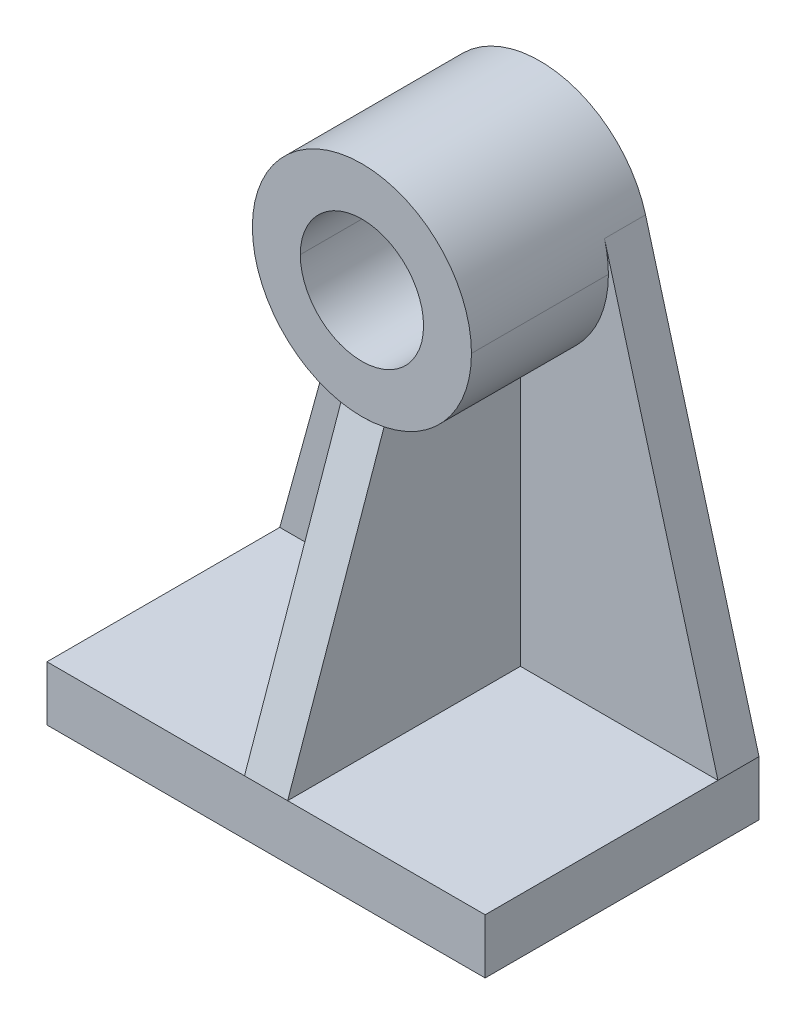
ISO-10303-21;
HEADER;
FILE_DESCRIPTION(('STEP AP214'),'2;1');
FILE_NAME('part.step','',(''),(''),'','','');
FILE_SCHEMA(('AUTOMOTIVE_DESIGN { 1 0 10303 214 1 1 1 1 }'));
ENDSEC;
DATA;
#1=APPLICATION_CONTEXT('core data for automotive mechanical design processes');
#2=APPLICATION_PROTOCOL_DEFINITION('international standard','automotive_design',2000,#1);
#3=PRODUCT_CONTEXT('',#1,'mechanical');
#4=PRODUCT('Part','Part','',(#3));
#5=PRODUCT_RELATED_PRODUCT_CATEGORY('part','',(#4));
#6=PRODUCT_DEFINITION_FORMATION('','',#4);
#7=PRODUCT_DEFINITION_CONTEXT('part definition',#1,'design');
#8=PRODUCT_DEFINITION('design','',#6,#7);
#9=PRODUCT_DEFINITION_SHAPE('','',#8);
#10=(LENGTH_UNIT() NAMED_UNIT(*) SI_UNIT(.MILLI.,.METRE.));
#11=(NAMED_UNIT(*) PLANE_ANGLE_UNIT() SI_UNIT($,.RADIAN.));
#12=(NAMED_UNIT(*) SI_UNIT($,.STERADIAN.) SOLID_ANGLE_UNIT());
#13=UNCERTAINTY_MEASURE_WITH_UNIT(LENGTH_MEASURE(1.E-05),#10,'distance_accuracy_value','');
#14=(GEOMETRIC_REPRESENTATION_CONTEXT(3) GLOBAL_UNCERTAINTY_ASSIGNED_CONTEXT((#13)) GLOBAL_UNIT_ASSIGNED_CONTEXT((#10,
#11,#12)) REPRESENTATION_CONTEXT('',''));
#15=CARTESIAN_POINT('',(0.,0.,0.));
#16=DIRECTION('',(0.,0.,1.));
#17=DIRECTION('',(1.,0.,0.));
#18=AXIS2_PLACEMENT_3D('',#15,#16,#17);
#19=CARTESIAN_POINT('',(-50.8,-88.9,63.5));
#20=DIRECTION('',(0.,-1.,0.));
#21=DIRECTION('',(0.,0.,-1.));
#22=AXIS2_PLACEMENT_3D('',#19,#20,#21);
#23=PLANE('',#22);
#24=DIRECTION('',(0.,0.,1.));
#25=VECTOR('',#24,1.);
#26=CARTESIAN_POINT('',(-5.,-88.9,63.5));
#27=LINE('',#26,#25);
#28=CARTESIAN_POINT('',(-5.,-88.9,9.52500000000001));
#29=VERTEX_POINT('',#28);
#30=CARTESIAN_POINT('',(-5.,-88.9,63.5));
#31=VERTEX_POINT('',#30);
#32=EDGE_CURVE('E310',#29,#31,#27,.T.);
#33=ORIENTED_EDGE('',*,*,#32,.F.);
#34=DIRECTION('',(-1.,0.,0.));
#35=VECTOR('',#34,1.);
#36=CARTESIAN_POINT('',(-50.8,-88.9,9.525));
#37=LINE('',#36,#35);
#38=CARTESIAN_POINT('',(-50.8,-88.9,9.525));
#39=VERTEX_POINT('',#38);
#40=EDGE_CURVE('E153',#29,#39,#37,.T.);
#41=ORIENTED_EDGE('',*,*,#40,.T.);
#42=DIRECTION('',(0.,0.,-1.));
#43=VECTOR('',#42,1.);
#44=CARTESIAN_POINT('',(-50.8,-88.9,63.5));
#45=LINE('',#44,#43);
#46=CARTESIAN_POINT('',(-50.8,-88.9,63.5));
#47=VERTEX_POINT('',#46);
#48=EDGE_CURVE('E224',#47,#39,#45,.T.);
#49=ORIENTED_EDGE('',*,*,#48,.F.);
#50=DIRECTION('',(-1.,0.,0.));
#51=VECTOR('',#50,1.);
#52=CARTESIAN_POINT('',(-50.8,-88.9,63.5));
#53=LINE('',#52,#51);
#54=EDGE_CURVE('E250',#31,#47,#53,.T.);
#55=ORIENTED_EDGE('',*,*,#54,.F.);
#56=EDGE_LOOP('',(#33,#41,#49,#55));
#57=FACE_BOUND('',#56,.T.);
#58=ADVANCED_FACE('F43',(#57),#23,.F.);
#59=CARTESIAN_POINT('',(0.,0.,9.525));
#60=DIRECTION('',(0.,0.,-1.));
#61=DIRECTION('',(-1.,0.,0.));
#62=AXIS2_PLACEMENT_3D('',#59,#60,#61);
#63=CYLINDRICAL_SURFACE('',#62,25.4);
#64=DIRECTION('',(0.,0.,-1.));
#65=VECTOR('',#64,1.);
#66=CARTESIAN_POINT('',(5.,-24.9030118660374,9.525));
#67=LINE('',#66,#65);
#68=CARTESIAN_POINT('',(5.,-24.9030118660374,9.525));
#69=VERTEX_POINT('',#68);
#70=CARTESIAN_POINT('',(5.,-24.9030118660374,41.1010541531131));
#71=VERTEX_POINT('',#70);
#72=EDGE_CURVE('E326',#69,#71,#67,.F.);
#73=ORIENTED_EDGE('',*,*,#72,.F.);
#74=CARTESIAN_POINT('',(0.,0.,9.525));
#75=DIRECTION('',(0.,0.,-1.));
#76=DIRECTION('',(1.,0.,0.));
#77=AXIS2_PLACEMENT_3D('',#74,#75,#76);
#78=CIRCLE('',#77,25.4);
#79=CARTESIAN_POINT('',(25.4,0.,9.525));
#80=VERTEX_POINT('',#79);
#81=EDGE_CURVE('E100',#80,#69,#78,.T.);
#82=ORIENTED_EDGE('',*,*,#81,.F.);
#83=DIRECTION('',(0.,0.,-1.));
#84=VECTOR('',#83,1.);
#85=CARTESIAN_POINT('',(25.4,0.,9.525));
#86=LINE('',#85,#84);
#87=CARTESIAN_POINT('',(25.4,0.,41.275));
#88=VERTEX_POINT('',#87);
#89=EDGE_CURVE('E272',#88,#80,#86,.T.);
#90=ORIENTED_EDGE('',*,*,#89,.F.);
#91=CARTESIAN_POINT('',(0.,0.,41.275));
#92=DIRECTION('',(0.,0.,1.));
#93=DIRECTION('',(1.,0.,0.));
#94=AXIS2_PLACEMENT_3D('',#91,#92,#93);
#95=CIRCLE('',#94,25.4);
#96=CARTESIAN_POINT('',(0.,-25.4,41.275));
#97=VERTEX_POINT('',#96);
#98=EDGE_CURVE('E243',#97,#88,#95,.T.);
#99=ORIENTED_EDGE('',*,*,#98,.F.);
#100=CARTESIAN_POINT('',(0.,0.,32.385));
#101=DIRECTION('',(0.,0.330350424728106,0.943858356366018));
#102=DIRECTION('',(0.,0.943858356366018,-0.330350424728106));
#103=AXIS2_PLACEMENT_3D('',#100,#101,#102);
#104=ELLIPSE('',#103,26.9108175275297,25.4);
#105=EDGE_CURVE('E334',#71,#97,#104,.F.);
#106=ORIENTED_EDGE('',*,*,#105,.F.);
#107=EDGE_LOOP('',(#73,#82,#90,#99,#106));
#108=FACE_BOUND('',#107,.T.);
#109=ADVANCED_FACE('F546',(#108),#63,.T.);
#110=CARTESIAN_POINT('',(0.,0.,9.525));
#111=DIRECTION('',(0.,0.,1.));
#112=DIRECTION('',(1.,0.,0.));
#113=AXIS2_PLACEMENT_3D('',#110,#111,#112);
#114=PLANE('',#113);
#115=ORIENTED_EDGE('',*,*,#40,.F.);
#116=DIRECTION('',(0.,1.,0.));
#117=VECTOR('',#116,1.);
#118=CARTESIAN_POINT('',(-5.,0.,9.525));
#119=LINE('',#118,#117);
#120=CARTESIAN_POINT('',(-5.,-24.9030118660374,9.525));
#121=VERTEX_POINT('',#120);
#122=EDGE_CURVE('E306',#29,#121,#119,.T.);
#123=ORIENTED_EDGE('',*,*,#122,.T.);
#124=CARTESIAN_POINT('',(-25.4,0.,9.525));
#125=VERTEX_POINT('',#124);
#126=EDGE_CURVE('E285',#121,#125,#78,.T.);
#127=ORIENTED_EDGE('',*,*,#126,.T.);
#128=CARTESIAN_POINT('',(0.,0.,9.525));
#129=DIRECTION('',(0.,0.,-1.));
#130=DIRECTION('',(1.,0.,0.));
#131=AXIS2_PLACEMENT_3D('',#128,#129,#130);
#132=CIRCLE('',#131,25.4);
#133=CARTESIAN_POINT('',(-24.4901906519416,6.73725180110948,9.525));
#134=VERTEX_POINT('',#133);
#135=EDGE_CURVE('E236',#125,#134,#132,.T.);
#136=ORIENTED_EDGE('',*,*,#135,.T.);
#137=DIRECTION('',(-0.265246133901948,-0.964180734328409,0.));
#138=VECTOR('',#137,1.);
#139=CARTESIAN_POINT('',(-50.8,-88.9,9.525));
#140=LINE('',#139,#138);
#141=EDGE_CURVE('E305',#134,#39,#140,.T.);
#142=ORIENTED_EDGE('',*,*,#141,.T.);
#143=EDGE_LOOP('',(#115,#123,#127,#136,#142));
#144=FACE_BOUND('',#143,.T.);
#145=ADVANCED_FACE('F304',(#144),#114,.T.);
#146=CARTESIAN_POINT('',(0.,0.,0.));
#147=DIRECTION('',(0.,0.,1.));
#148=DIRECTION('',(1.,0.,0.));
#149=AXIS2_PLACEMENT_3D('',#146,#147,#148);
#150=CYLINDRICAL_SURFACE('',#149,14.2875);
#151=DIRECTION('',(0.,0.,1.));
#152=VECTOR('',#151,1.);
#153=CARTESIAN_POINT('',(-14.2875,0.,0.));
#154=LINE('',#153,#152);
#155=CARTESIAN_POINT('',(-14.2875,0.,0.));
#156=VERTEX_POINT('',#155);
#157=CARTESIAN_POINT('',(-14.2875,0.,41.275));
#158=VERTEX_POINT('',#157);
#159=EDGE_CURVE('E230',#156,#158,#154,.T.);
#160=ORIENTED_EDGE('',*,*,#159,.F.);
#161=CARTESIAN_POINT('',(0.,0.,0.));
#162=DIRECTION('',(0.,0.,1.));
#163=DIRECTION('',(1.,0.,0.));
#164=AXIS2_PLACEMENT_3D('',#161,#162,#163);
#165=CIRCLE('',#164,14.2875);
#166=CARTESIAN_POINT('',(14.2875,0.,0.));
#167=VERTEX_POINT('',#166);
#168=EDGE_CURVE('E247',#167,#156,#165,.T.);
#169=ORIENTED_EDGE('',*,*,#168,.F.);
#170=DIRECTION('',(0.,0.,1.));
#171=VECTOR('',#170,1.);
#172=CARTESIAN_POINT('',(14.2875,0.,0.));
#173=LINE('',#172,#171);
#174=CARTESIAN_POINT('',(14.2875,0.,41.275));
#175=VERTEX_POINT('',#174);
#176=EDGE_CURVE('E251',#167,#175,#173,.T.);
#177=ORIENTED_EDGE('',*,*,#176,.T.);
#178=CARTESIAN_POINT('',(0.,0.,41.275));
#179=DIRECTION('',(0.,0.,1.));
#180=DIRECTION('',(1.,0.,0.));
#181=AXIS2_PLACEMENT_3D('',#178,#179,#180);
#182=CIRCLE('',#181,14.2875);
#183=EDGE_CURVE('E11',#175,#158,#182,.T.);
#184=ORIENTED_EDGE('',*,*,#183,.T.);
#185=EDGE_LOOP('',(#160,#169,#177,#184));
#186=FACE_BOUND('',#185,.T.);
#187=ADVANCED_FACE('F376',(#186),#150,.F.);
#188=CARTESIAN_POINT('',(0.,0.,41.275));
#189=DIRECTION('',(0.,0.,1.));
#190=DIRECTION('',(1.,0.,0.));
#191=AXIS2_PLACEMENT_3D('',#188,#189,#190);
#192=PLANE('',#191);
#193=ORIENTED_EDGE('',*,*,#183,.F.);
#194=CARTESIAN_POINT('',(0.,0.,41.275));
#195=DIRECTION('',(0.,0.,1.));
#196=DIRECTION('',(1.,0.,0.));
#197=AXIS2_PLACEMENT_3D('',#194,#195,#196);
#198=CIRCLE('',#197,14.2875);
#199=EDGE_CURVE('E234',#158,#175,#198,.T.);
#200=ORIENTED_EDGE('',*,*,#199,.F.);
#201=EDGE_LOOP('',(#193,#200));
#202=FACE_BOUND('',#201,.T.);
#203=CARTESIAN_POINT('',(-25.4,0.,41.275));
#204=VERTEX_POINT('',#203);
#205=EDGE_CURVE('E117',#204,#97,#95,.T.);
#206=ORIENTED_EDGE('',*,*,#205,.T.);
#207=ORIENTED_EDGE('',*,*,#98,.T.);
#208=CARTESIAN_POINT('',(0.,0.,41.275));
#209=DIRECTION('',(0.,0.,1.));
#210=DIRECTION('',(1.,0.,0.));
#211=AXIS2_PLACEMENT_3D('',#208,#209,#210);
#212=CIRCLE('',#211,25.4);
#213=EDGE_CURVE('E254',#88,#204,#212,.T.);
#214=ORIENTED_EDGE('',*,*,#213,.T.);
#215=EDGE_LOOP('',(#206,#207,#214));
#216=FACE_BOUND('',#215,.T.);
#217=ADVANCED_FACE('F372',(#202,#216),#192,.T.);
#218=CARTESIAN_POINT('',(50.8,-101.6,63.5));
#219=DIRECTION('',(0.,0.,1.));
#220=DIRECTION('',(1.,0.,0.));
#221=AXIS2_PLACEMENT_3D('',#218,#219,#220);
#222=PLANE('',#221);
#223=CARTESIAN_POINT('',(50.8,-88.9,63.5));
#224=VERTEX_POINT('',#223);
#225=CARTESIAN_POINT('',(5.,-88.9,63.5));
#226=VERTEX_POINT('',#225);
#227=EDGE_CURVE('E53',#224,#226,#53,.T.);
#228=ORIENTED_EDGE('',*,*,#227,.T.);
#229=DIRECTION('',(-1.,0.,0.));
#230=VECTOR('',#229,1.);
#231=CARTESIAN_POINT('',(-50.8,-88.9,63.5));
#232=LINE('',#231,#230);
#233=EDGE_CURVE('E246',#226,#31,#232,.T.);
#234=ORIENTED_EDGE('',*,*,#233,.T.);
#235=ORIENTED_EDGE('',*,*,#54,.T.);
#236=DIRECTION('',(0.,-1.,0.));
#237=VECTOR('',#236,1.);
#238=CARTESIAN_POINT('',(-50.8,-88.9,63.5));
#239=LINE('',#238,#237);
#240=CARTESIAN_POINT('',(-50.8,-101.6,63.5));
#241=VERTEX_POINT('',#240);
#242=EDGE_CURVE('E201',#47,#241,#239,.T.);
#243=ORIENTED_EDGE('',*,*,#242,.T.);
#244=DIRECTION('',(1.,0.,0.));
#245=VECTOR('',#244,1.);
#246=CARTESIAN_POINT('',(-50.8,-101.6,63.5));
#247=LINE('',#246,#245);
#248=CARTESIAN_POINT('',(50.8,-101.6,63.5));
#249=VERTEX_POINT('',#248);
#250=EDGE_CURVE('E196',#241,#249,#247,.T.);
#251=ORIENTED_EDGE('',*,*,#250,.T.);
#252=DIRECTION('',(0.,1.,0.));
#253=VECTOR('',#252,1.);
#254=CARTESIAN_POINT('',(50.8,-101.6,63.5));
#255=LINE('',#254,#253);
#256=EDGE_CURVE('E199',#249,#224,#255,.T.);
#257=ORIENTED_EDGE('',*,*,#256,.T.);
#258=EDGE_LOOP('',(#228,#234,#235,#243,#251,#257));
#259=FACE_BOUND('',#258,.T.);
#260=ADVANCED_FACE('F198',(#259),#222,.T.);
#261=CARTESIAN_POINT('',(50.8,-88.9,9.525));
#262=VERTEX_POINT('',#261);
#263=CARTESIAN_POINT('',(5.,-88.9,9.52500000000001));
#264=VERTEX_POINT('',#263);
#265=EDGE_CURVE('E354',#262,#264,#37,.T.);
#266=ORIENTED_EDGE('',*,*,#265,.T.);
#267=DIRECTION('',(0.,0.,1.));
#268=VECTOR('',#267,1.);
#269=CARTESIAN_POINT('',(5.,-88.9,63.5));
#270=LINE('',#269,#268);
#271=EDGE_CURVE('E314',#264,#226,#270,.T.);
#272=ORIENTED_EDGE('',*,*,#271,.T.);
#273=ORIENTED_EDGE('',*,*,#227,.F.);
#274=DIRECTION('',(0.,0.,-1.));
#275=VECTOR('',#274,1.);
#276=CARTESIAN_POINT('',(50.8,-88.9,63.5));
#277=LINE('',#276,#275);
#278=EDGE_CURVE('E164',#224,#262,#277,.T.);
#279=ORIENTED_EDGE('',*,*,#278,.T.);
#280=EDGE_LOOP('',(#266,#272,#273,#279));
#281=FACE_BOUND('',#280,.T.);
#282=ADVANCED_FACE('F380',(#281),#23,.F.);
#283=CARTESIAN_POINT('',(0.,0.,0.));
#284=DIRECTION('',(0.,0.,1.));
#285=DIRECTION('',(1.,0.,0.));
#286=AXIS2_PLACEMENT_3D('',#283,#284,#285);
#287=PLANE('',#286);
#288=CARTESIAN_POINT('',(0.,0.,0.));
#289=DIRECTION('',(0.,0.,1.));
#290=DIRECTION('',(1.,0.,0.));
#291=AXIS2_PLACEMENT_3D('',#288,#289,#290);
#292=CIRCLE('',#291,14.2875);
#293=EDGE_CURVE('E235',#156,#167,#292,.T.);
#294=ORIENTED_EDGE('',*,*,#293,.T.);
#295=ORIENTED_EDGE('',*,*,#168,.T.);
#296=EDGE_LOOP('',(#294,#295));
#297=FACE_BOUND('',#296,.T.);
#298=DIRECTION('',(0.,1.,0.));
#299=VECTOR('',#298,1.);
#300=CARTESIAN_POINT('',(50.8,-101.6,0.));
#301=LINE('',#300,#299);
#302=CARTESIAN_POINT('',(50.8,-101.6,0.));
#303=VERTEX_POINT('',#302);
#304=CARTESIAN_POINT('',(50.8,-88.9,0.));
#305=VERTEX_POINT('',#304);
#306=EDGE_CURVE('E207',#303,#305,#301,.T.);
#307=ORIENTED_EDGE('',*,*,#306,.F.);
#308=DIRECTION('',(1.,0.,0.));
#309=VECTOR('',#308,1.);
#310=CARTESIAN_POINT('',(-50.8,-101.6,0.));
#311=LINE('',#310,#309);
#312=CARTESIAN_POINT('',(-50.8,-101.6,0.));
#313=VERTEX_POINT('',#312);
#314=EDGE_CURVE('E218',#313,#303,#311,.T.);
#315=ORIENTED_EDGE('',*,*,#314,.F.);
#316=DIRECTION('',(0.,-1.,0.));
#317=VECTOR('',#316,1.);
#318=CARTESIAN_POINT('',(-50.8,-101.6,0.));
#319=LINE('',#318,#317);
#320=CARTESIAN_POINT('',(-50.8,-88.9,0.));
#321=VERTEX_POINT('',#320);
#322=EDGE_CURVE('E47',#321,#313,#319,.T.);
#323=ORIENTED_EDGE('',*,*,#322,.F.);
#324=DIRECTION('',(-0.265246133901948,-0.964180734328409,0.));
#325=VECTOR('',#324,1.);
#326=CARTESIAN_POINT('',(-50.8,-88.9,0.));
#327=LINE('',#326,#325);
#328=CARTESIAN_POINT('',(-24.4901906519416,6.73725180110948,0.));
#329=VERTEX_POINT('',#328);
#330=EDGE_CURVE('E265',#329,#321,#327,.T.);
#331=ORIENTED_EDGE('',*,*,#330,.F.);
#332=CARTESIAN_POINT('',(0.,0.,0.));
#333=DIRECTION('',(0.,0.,1.));
#334=DIRECTION('',(1.,0.,0.));
#335=AXIS2_PLACEMENT_3D('',#332,#333,#334);
#336=CIRCLE('',#335,25.4);
#337=CARTESIAN_POINT('',(24.4901906519415,6.73725180110949,0.));
#338=VERTEX_POINT('',#337);
#339=EDGE_CURVE('E259',#338,#329,#336,.T.);
#340=ORIENTED_EDGE('',*,*,#339,.F.);
#341=DIRECTION('',(-0.265246133901948,0.964180734328409,0.));
#342=VECTOR('',#341,1.);
#343=CARTESIAN_POINT('',(50.8,-88.9,0.));
#344=LINE('',#343,#342);
#345=EDGE_CURVE('E215',#305,#338,#344,.T.);
#346=ORIENTED_EDGE('',*,*,#345,.F.);
#347=EDGE_LOOP('',(#307,#315,#323,#331,#340,#346));
#348=FACE_BOUND('',#347,.T.);
#349=ADVANCED_FACE('F378',(#297,#348),#287,.F.);
#350=CARTESIAN_POINT('',(-5.,-24.9030118660374,41.1010541531131));
#351=VERTEX_POINT('',#350);
#352=EDGE_CURVE('E330',#97,#351,#104,.F.);
#353=ORIENTED_EDGE('',*,*,#352,.F.);
#354=ORIENTED_EDGE('',*,*,#205,.F.);
#355=DIRECTION('',(0.,0.,-1.));
#356=VECTOR('',#355,1.);
#357=CARTESIAN_POINT('',(-25.4,0.,9.525));
#358=LINE('',#357,#356);
#359=EDGE_CURVE('E228',#204,#125,#358,.T.);
#360=ORIENTED_EDGE('',*,*,#359,.T.);
#361=ORIENTED_EDGE('',*,*,#126,.F.);
#362=DIRECTION('',(0.,0.,-1.));
#363=VECTOR('',#362,1.);
#364=CARTESIAN_POINT('',(-5.,-24.9030118660374,9.525));
#365=LINE('',#364,#363);
#366=EDGE_CURVE('E61',#121,#351,#365,.F.);
#367=ORIENTED_EDGE('',*,*,#366,.T.);
#368=EDGE_LOOP('',(#353,#354,#360,#361,#367));
#369=FACE_BOUND('',#368,.T.);
#370=ADVANCED_FACE('F297',(#369),#63,.T.);
#371=CARTESIAN_POINT('',(50.8,-88.9,9.525));
#372=DIRECTION('',(-0.964180734328409,-0.265246133901948,0.));
#373=DIRECTION('',(-0.265246133901948,0.964180734328409,0.));
#374=AXIS2_PLACEMENT_3D('',#371,#372,#373);
#375=PLANE('',#374);
#376=ORIENTED_EDGE('',*,*,#345,.T.);
#377=DIRECTION('',(0.,0.,-1.));
#378=VECTOR('',#377,1.);
#379=CARTESIAN_POINT('',(24.4901906519415,6.73725180110949,9.525));
#380=LINE('',#379,#378);
#381=CARTESIAN_POINT('',(24.4901906519416,6.73725180110948,9.525));
#382=VERTEX_POINT('',#381);
#383=EDGE_CURVE('E271',#382,#338,#380,.T.);
#384=ORIENTED_EDGE('',*,*,#383,.F.);
#385=DIRECTION('',(-0.265246133901948,0.964180734328409,0.));
#386=VECTOR('',#385,1.);
#387=CARTESIAN_POINT('',(50.8,-88.9,9.525));
#388=LINE('',#387,#386);
#389=EDGE_CURVE('E283',#262,#382,#388,.T.);
#390=ORIENTED_EDGE('',*,*,#389,.F.);
#391=DIRECTION('',(0.,0.,-1.));
#392=VECTOR('',#391,1.);
#393=CARTESIAN_POINT('',(50.8,-88.9,9.525));
#394=LINE('',#393,#392);
#395=EDGE_CURVE('E278',#262,#305,#394,.T.);
#396=ORIENTED_EDGE('',*,*,#395,.T.);
#397=EDGE_LOOP('',(#376,#384,#390,#396));
#398=FACE_BOUND('',#397,.T.);
#399=ADVANCED_FACE('F386',(#398),#375,.F.);
#400=CARTESIAN_POINT('',(50.8,-101.6,9.525));
#401=DIRECTION('',(-1.,0.,0.));
#402=DIRECTION('',(0.,0.,1.));
#403=AXIS2_PLACEMENT_3D('',#400,#401,#402);
#404=PLANE('',#403);
#405=ORIENTED_EDGE('',*,*,#306,.T.);
#406=ORIENTED_EDGE('',*,*,#395,.F.);
#407=ORIENTED_EDGE('',*,*,#278,.F.);
#408=ORIENTED_EDGE('',*,*,#256,.F.);
#409=DIRECTION('',(0.,0.,-1.));
#410=VECTOR('',#409,1.);
#411=CARTESIAN_POINT('',(50.8,-101.6,9.525));
#412=LINE('',#411,#410);
#413=EDGE_CURVE('E208',#249,#303,#412,.T.);
#414=ORIENTED_EDGE('',*,*,#413,.T.);
#415=EDGE_LOOP('',(#405,#406,#407,#408,#414));
#416=FACE_BOUND('',#415,.T.);
#417=ADVANCED_FACE('F213',(#416),#404,.F.);
#418=CARTESIAN_POINT('',(-50.8,-101.6,9.525));
#419=DIRECTION('',(0.,1.,0.));
#420=DIRECTION('',(1.,0.,0.));
#421=AXIS2_PLACEMENT_3D('',#418,#419,#420);
#422=PLANE('',#421);
#423=ORIENTED_EDGE('',*,*,#413,.F.);
#424=ORIENTED_EDGE('',*,*,#250,.F.);
#425=DIRECTION('',(0.,0.,-1.));
#426=VECTOR('',#425,1.);
#427=CARTESIAN_POINT('',(-50.8,-101.6,9.525));
#428=LINE('',#427,#426);
#429=EDGE_CURVE('E339',#241,#313,#428,.T.);
#430=ORIENTED_EDGE('',*,*,#429,.T.);
#431=ORIENTED_EDGE('',*,*,#314,.T.);
#432=EDGE_LOOP('',(#423,#424,#430,#431));
#433=FACE_BOUND('',#432,.T.);
#434=ADVANCED_FACE('F217',(#433),#422,.F.);
#435=CARTESIAN_POINT('',(-50.8,-101.6,9.525));
#436=DIRECTION('',(1.,0.,0.));
#437=DIRECTION('',(0.,-1.,0.));
#438=AXIS2_PLACEMENT_3D('',#435,#436,#437);
#439=PLANE('',#438);
#440=ORIENTED_EDGE('',*,*,#322,.T.);
#441=ORIENTED_EDGE('',*,*,#429,.F.);
#442=ORIENTED_EDGE('',*,*,#242,.F.);
#443=ORIENTED_EDGE('',*,*,#48,.T.);
#444=DIRECTION('',(0.,0.,-1.));
#445=VECTOR('',#444,1.);
#446=CARTESIAN_POINT('',(-50.8,-88.9,9.525));
#447=LINE('',#446,#445);
#448=EDGE_CURVE('E262',#39,#321,#447,.T.);
#449=ORIENTED_EDGE('',*,*,#448,.T.);
#450=EDGE_LOOP('',(#440,#441,#442,#443,#449));
#451=FACE_BOUND('',#450,.T.);
#452=ADVANCED_FACE('F421',(#451),#439,.F.);
#453=CARTESIAN_POINT('',(-50.8,-88.9,9.525));
#454=DIRECTION('',(0.964180734328409,-0.265246133901948,0.));
#455=DIRECTION('',(0.,0.,-1.));
#456=AXIS2_PLACEMENT_3D('',#453,#454,#455);
#457=PLANE('',#456);
#458=ORIENTED_EDGE('',*,*,#330,.T.);
#459=ORIENTED_EDGE('',*,*,#448,.F.);
#460=ORIENTED_EDGE('',*,*,#141,.F.);
#461=DIRECTION('',(0.,0.,-1.));
#462=VECTOR('',#461,1.);
#463=CARTESIAN_POINT('',(-24.4901906519416,6.73725180110948,9.525));
#464=LINE('',#463,#462);
#465=EDGE_CURVE('E240',#134,#329,#464,.T.);
#466=ORIENTED_EDGE('',*,*,#465,.T.);
#467=EDGE_LOOP('',(#458,#459,#460,#466));
#468=FACE_BOUND('',#467,.T.);
#469=ADVANCED_FACE('F577',(#468),#457,.F.);
#470=DIRECTION('',(0.,1.,0.));
#471=VECTOR('',#470,1.);
#472=CARTESIAN_POINT('',(5.,0.,9.525));
#473=LINE('',#472,#471);
#474=EDGE_CURVE('E322',#264,#69,#473,.T.);
#475=ORIENTED_EDGE('',*,*,#474,.F.);
#476=ORIENTED_EDGE('',*,*,#265,.F.);
#477=ORIENTED_EDGE('',*,*,#389,.T.);
#478=CARTESIAN_POINT('',(0.,0.,9.525));
#479=DIRECTION('',(0.,0.,-1.));
#480=DIRECTION('',(1.,0.,0.));
#481=AXIS2_PLACEMENT_3D('',#478,#479,#480);
#482=CIRCLE('',#481,25.4);
#483=EDGE_CURVE('E268',#382,#80,#482,.T.);
#484=ORIENTED_EDGE('',*,*,#483,.T.);
#485=ORIENTED_EDGE('',*,*,#81,.T.);
#486=EDGE_LOOP('',(#475,#476,#477,#484,#485));
#487=FACE_BOUND('',#486,.T.);
#488=ADVANCED_FACE('F45',(#487),#114,.T.);
#489=CARTESIAN_POINT('',(0.,0.,9.525));
#490=DIRECTION('',(0.,0.,-1.));
#491=DIRECTION('',(-1.,0.,0.));
#492=AXIS2_PLACEMENT_3D('',#489,#490,#491);
#493=CYLINDRICAL_SURFACE('',#492,25.4);
#494=ORIENTED_EDGE('',*,*,#339,.T.);
#495=ORIENTED_EDGE('',*,*,#465,.F.);
#496=ORIENTED_EDGE('',*,*,#135,.F.);
#497=ORIENTED_EDGE('',*,*,#359,.F.);
#498=ORIENTED_EDGE('',*,*,#213,.F.);
#499=ORIENTED_EDGE('',*,*,#89,.T.);
#500=ORIENTED_EDGE('',*,*,#483,.F.);
#501=ORIENTED_EDGE('',*,*,#383,.T.);
#502=EDGE_LOOP('',(#494,#495,#496,#497,#498,#499,#500,#501));
#503=FACE_BOUND('',#502,.T.);
#504=ADVANCED_FACE('F301',(#503),#493,.T.);
#505=CARTESIAN_POINT('',(0.,0.,0.));
#506=DIRECTION('',(0.,0.,1.));
#507=DIRECTION('',(1.,0.,0.));
#508=AXIS2_PLACEMENT_3D('',#505,#506,#507);
#509=CYLINDRICAL_SURFACE('',#508,14.2875);
#510=ORIENTED_EDGE('',*,*,#176,.F.);
#511=ORIENTED_EDGE('',*,*,#293,.F.);
#512=ORIENTED_EDGE('',*,*,#159,.T.);
#513=ORIENTED_EDGE('',*,*,#199,.T.);
#514=EDGE_LOOP('',(#510,#511,#512,#513));
#515=FACE_BOUND('',#514,.T.);
#516=ADVANCED_FACE('F367',(#515),#509,.F.);
#517=CARTESIAN_POINT('',(0.,-25.4,41.275));
#518=DIRECTION('',(0.,0.330350424728106,0.943858356366018));
#519=DIRECTION('',(0.,-0.943858356366017,0.330350424728106));
#520=AXIS2_PLACEMENT_3D('',#517,#518,#519);
#521=PLANE('',#520);
#522=ORIENTED_EDGE('',*,*,#233,.F.);
#523=DIRECTION('',(0.,-0.943858356366017,0.330350424728106));
#524=VECTOR('',#523,1.);
#525=CARTESIAN_POINT('',(5.,-25.4,41.275));
#526=LINE('',#525,#524);
#527=EDGE_CURVE('E316',#71,#226,#526,.T.);
#528=ORIENTED_EDGE('',*,*,#527,.F.);
#529=ORIENTED_EDGE('',*,*,#105,.T.);
#530=ORIENTED_EDGE('',*,*,#352,.T.);
#531=DIRECTION('',(0.,-0.943858356366017,0.330350424728106));
#532=VECTOR('',#531,1.);
#533=CARTESIAN_POINT('',(-5.,-25.4,41.275));
#534=LINE('',#533,#532);
#535=EDGE_CURVE('E407',#351,#31,#534,.T.);
#536=ORIENTED_EDGE('',*,*,#535,.T.);
#537=EDGE_LOOP('',(#522,#528,#529,#530,#536));
#538=FACE_BOUND('',#537,.T.);
#539=ADVANCED_FACE('F406',(#538),#521,.T.);
#540=CARTESIAN_POINT('',(5.,-38.1,31.75));
#541=DIRECTION('',(1.,0.,0.));
#542=DIRECTION('',(0.,0.,-1.));
#543=AXIS2_PLACEMENT_3D('',#540,#541,#542);
#544=PLANE('',#543);
#545=ORIENTED_EDGE('',*,*,#474,.T.);
#546=ORIENTED_EDGE('',*,*,#72,.T.);
#547=ORIENTED_EDGE('',*,*,#527,.T.);
#548=ORIENTED_EDGE('',*,*,#271,.F.);
#549=EDGE_LOOP('',(#545,#546,#547,#548));
#550=FACE_BOUND('',#549,.T.);
#551=ADVANCED_FACE('F417',(#550),#544,.T.);
#552=CARTESIAN_POINT('',(-5.,-38.1,31.75));
#553=DIRECTION('',(1.,0.,0.));
#554=DIRECTION('',(0.,0.,-1.));
#555=AXIS2_PLACEMENT_3D('',#552,#553,#554);
#556=PLANE('',#555);
#557=ORIENTED_EDGE('',*,*,#366,.F.);
#558=ORIENTED_EDGE('',*,*,#122,.F.);
#559=ORIENTED_EDGE('',*,*,#32,.T.);
#560=ORIENTED_EDGE('',*,*,#535,.F.);
#561=EDGE_LOOP('',(#557,#558,#559,#560));
#562=FACE_BOUND('',#561,.T.);
#563=ADVANCED_FACE('F412',(#562),#556,.F.);
#564=CLOSED_SHELL('',(#58,#109,#145,#187,#217,#260,#282,#349,#370,#399,#417,#434,#452,#469,#488,
#504,#516,#539,#551,#563));
#565=MANIFOLD_SOLID_BREP('B2',#564);
#566=ADVANCED_BREP_SHAPE_REPRESENTATION('',(#18,#565),#14);
#567=SHAPE_DEFINITION_REPRESENTATION(#9,#566);
ENDSEC;
END-ISO-10303-21;
